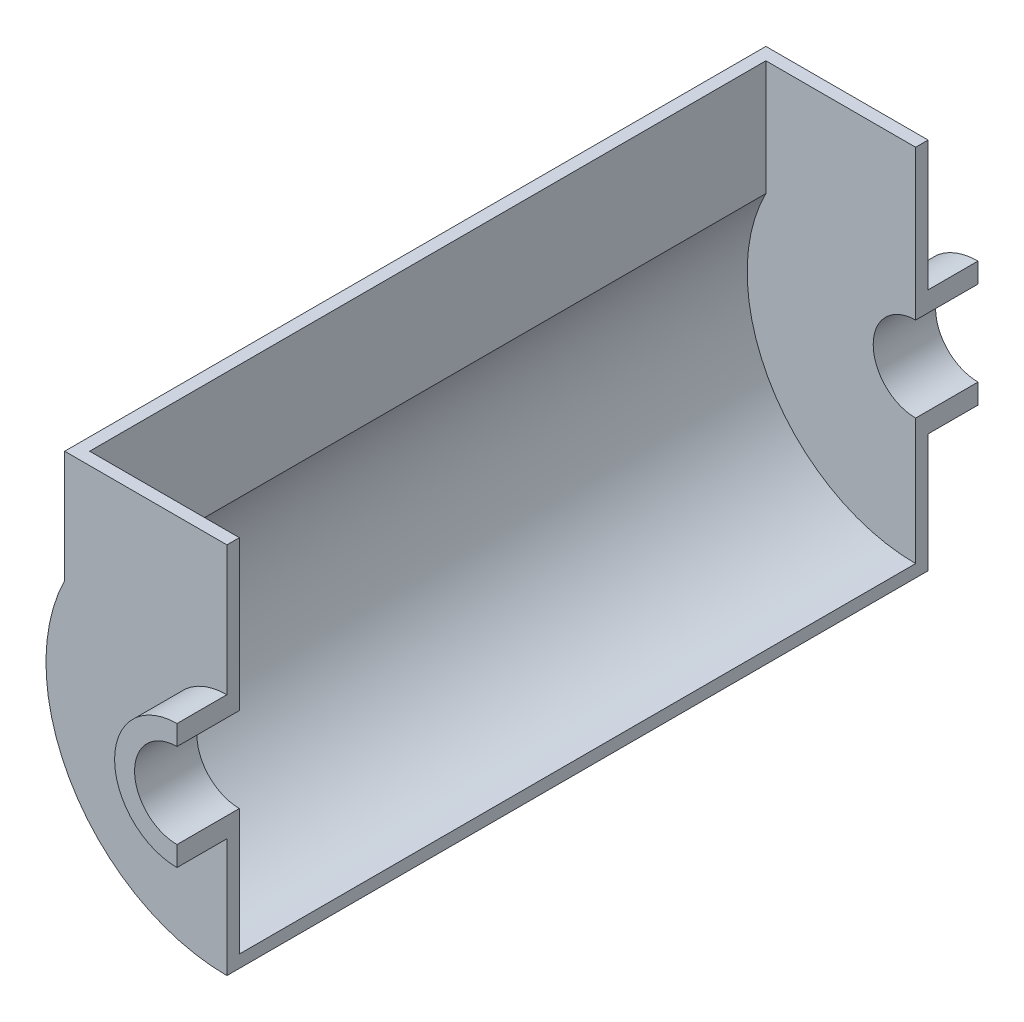
ISO-10303-21;
HEADER;
FILE_DESCRIPTION(('STEP AP214'),'2;1');
FILE_NAME('part.step','',(''),(''),'','','');
FILE_SCHEMA(('AUTOMOTIVE_DESIGN { 1 0 10303 214 1 1 1 1 }'));
ENDSEC;
DATA;
#1=APPLICATION_CONTEXT('core data for automotive mechanical design processes');
#2=APPLICATION_PROTOCOL_DEFINITION('international standard','automotive_design',2000,#1);
#3=PRODUCT_CONTEXT('',#1,'mechanical');
#4=PRODUCT('Part','Part','',(#3));
#5=PRODUCT_RELATED_PRODUCT_CATEGORY('part','',(#4));
#6=PRODUCT_DEFINITION_FORMATION('','',#4);
#7=PRODUCT_DEFINITION_CONTEXT('part definition',#1,'design');
#8=PRODUCT_DEFINITION('design','',#6,#7);
#9=PRODUCT_DEFINITION_SHAPE('','',#8);
#10=(LENGTH_UNIT() NAMED_UNIT(*) SI_UNIT(.MILLI.,.METRE.));
#11=(NAMED_UNIT(*) PLANE_ANGLE_UNIT() SI_UNIT($,.RADIAN.));
#12=(NAMED_UNIT(*) SI_UNIT($,.STERADIAN.) SOLID_ANGLE_UNIT());
#13=UNCERTAINTY_MEASURE_WITH_UNIT(LENGTH_MEASURE(1.E-05),#10,'distance_accuracy_value','');
#14=(GEOMETRIC_REPRESENTATION_CONTEXT(3) GLOBAL_UNCERTAINTY_ASSIGNED_CONTEXT((#13)) GLOBAL_UNIT_ASSIGNED_CONTEXT((#10,
#11,#12)) REPRESENTATION_CONTEXT('',''));
#15=CARTESIAN_POINT('',(0.,0.,0.));
#16=DIRECTION('',(0.,0.,1.));
#17=DIRECTION('',(1.,0.,0.));
#18=AXIS2_PLACEMENT_3D('',#15,#16,#17);
#19=CARTESIAN_POINT('',(0.,0.,-5.));
#20=DIRECTION('',(0.,0.,1.));
#21=DIRECTION('',(1.,0.,0.));
#22=AXIS2_PLACEMENT_3D('',#19,#20,#21);
#23=PLANE('',#22);
#24=CARTESIAN_POINT('',(0.,0.,-5.));
#25=DIRECTION('',(0.,0.,1.));
#26=DIRECTION('',(-1.,0.,0.));
#27=AXIS2_PLACEMENT_3D('',#24,#25,#26);
#28=CIRCLE('',#27,67.5);
#29=CARTESIAN_POINT('',(-60.,30.9232921921324,-5.));
#30=VERTEX_POINT('',#29);
#31=CARTESIAN_POINT('',(0.,-67.5,-5.));
#32=VERTEX_POINT('',#31);
#33=EDGE_CURVE('E197',#30,#32,#28,.T.);
#34=ORIENTED_EDGE('',*,*,#33,.F.);
#35=DIRECTION('',(0.,-1.,0.));
#36=VECTOR('',#35,1.);
#37=CARTESIAN_POINT('',(-60.,77.,-5.));
#38=LINE('',#37,#36);
#39=CARTESIAN_POINT('',(-60.,77.,-5.));
#40=VERTEX_POINT('',#39);
#41=EDGE_CURVE('E54',#40,#30,#38,.T.);
#42=ORIENTED_EDGE('',*,*,#41,.F.);
#43=DIRECTION('',(-1.,0.,0.));
#44=VECTOR('',#43,1.);
#45=CARTESIAN_POINT('',(0.,77.,-5.));
#46=LINE('',#45,#44);
#47=CARTESIAN_POINT('',(0.,77.,-5.));
#48=VERTEX_POINT('',#47);
#49=EDGE_CURVE('E213',#48,#40,#46,.T.);
#50=ORIENTED_EDGE('',*,*,#49,.F.);
#51=DIRECTION('',(0.,1.,0.));
#52=VECTOR('',#51,1.);
#53=CARTESIAN_POINT('',(0.,25.,-5.));
#54=LINE('',#53,#52);
#55=CARTESIAN_POINT('',(0.,17.,-5.));
#56=VERTEX_POINT('',#55);
#57=EDGE_CURVE('E255',#56,#48,#54,.T.);
#58=ORIENTED_EDGE('',*,*,#57,.F.);
#59=CARTESIAN_POINT('',(0.,0.,-5.));
#60=DIRECTION('',(0.,0.,-1.));
#61=DIRECTION('',(1.,0.,0.));
#62=AXIS2_PLACEMENT_3D('',#59,#60,#61);
#63=CIRCLE('',#62,17.);
#64=CARTESIAN_POINT('',(0.,-17.,-5.));
#65=VERTEX_POINT('',#64);
#66=EDGE_CURVE('E252',#65,#56,#63,.T.);
#67=ORIENTED_EDGE('',*,*,#66,.F.);
#68=DIRECTION('',(0.,1.,0.));
#69=VECTOR('',#68,1.);
#70=CARTESIAN_POINT('',(0.,-17.,-5.));
#71=LINE('',#70,#69);
#72=EDGE_CURVE('E60',#32,#65,#71,.T.);
#73=ORIENTED_EDGE('',*,*,#72,.F.);
#74=EDGE_LOOP('',(#34,#42,#50,#58,#67,#73));
#75=FACE_BOUND('',#74,.T.);
#76=ADVANCED_FACE('F37',(#75),#23,.F.);
#77=CARTESIAN_POINT('',(0.,0.,-5.));
#78=DIRECTION('',(0.,0.,1.));
#79=DIRECTION('',(1.,0.,0.));
#80=AXIS2_PLACEMENT_3D('',#77,#78,#79);
#81=CYLINDRICAL_SURFACE('',#80,17.);
#82=DIRECTION('',(0.,0.,1.));
#83=VECTOR('',#82,1.);
#84=CARTESIAN_POINT('',(0.,17.,-5.));
#85=LINE('',#84,#83);
#86=CARTESIAN_POINT('',(0.,17.,20.));
#87=VERTEX_POINT('',#86);
#88=EDGE_CURVE('E41',#56,#87,#85,.T.);
#89=ORIENTED_EDGE('',*,*,#88,.T.);
#90=CARTESIAN_POINT('',(0.,0.,20.));
#91=DIRECTION('',(0.,0.,-1.));
#92=DIRECTION('',(1.,0.,0.));
#93=AXIS2_PLACEMENT_3D('',#90,#91,#92);
#94=CIRCLE('',#93,17.);
#95=CARTESIAN_POINT('',(0.,-17.,20.));
#96=VERTEX_POINT('',#95);
#97=EDGE_CURVE('E235',#96,#87,#94,.T.);
#98=ORIENTED_EDGE('',*,*,#97,.F.);
#99=DIRECTION('',(0.,0.,1.));
#100=VECTOR('',#99,1.);
#101=CARTESIAN_POINT('',(0.,-17.,-5.));
#102=LINE('',#101,#100);
#103=EDGE_CURVE('E11',#65,#96,#102,.T.);
#104=ORIENTED_EDGE('',*,*,#103,.F.);
#105=ORIENTED_EDGE('',*,*,#66,.T.);
#106=EDGE_LOOP('',(#89,#98,#104,#105));
#107=FACE_BOUND('',#106,.T.);
#108=ADVANCED_FACE('F39',(#107),#81,.F.);
#109=CARTESIAN_POINT('',(0.,-17.,-5.));
#110=DIRECTION('',(1.,0.,0.));
#111=DIRECTION('',(0.,0.,-1.));
#112=AXIS2_PLACEMENT_3D('',#109,#110,#111);
#113=PLANE('',#112);
#114=ORIENTED_EDGE('',*,*,#103,.T.);
#115=DIRECTION('',(0.,1.,0.));
#116=VECTOR('',#115,1.);
#117=CARTESIAN_POINT('',(0.,-17.,20.));
#118=LINE('',#117,#116);
#119=CARTESIAN_POINT('',(0.,-25.,20.));
#120=VERTEX_POINT('',#119);
#121=EDGE_CURVE('E249',#120,#96,#118,.T.);
#122=ORIENTED_EDGE('',*,*,#121,.F.);
#123=DIRECTION('',(0.,0.,1.));
#124=VECTOR('',#123,1.);
#125=CARTESIAN_POINT('',(0.,-25.,-5.));
#126=LINE('',#125,#124);
#127=CARTESIAN_POINT('',(0.,-25.,0.));
#128=VERTEX_POINT('',#127);
#129=EDGE_CURVE('E46',#128,#120,#126,.T.);
#130=ORIENTED_EDGE('',*,*,#129,.F.);
#131=DIRECTION('',(0.,1.,0.));
#132=VECTOR('',#131,1.);
#133=CARTESIAN_POINT('',(0.,-25.,0.));
#134=LINE('',#133,#132);
#135=CARTESIAN_POINT('',(0.,-72.5,0.));
#136=VERTEX_POINT('',#135);
#137=EDGE_CURVE('E216',#136,#128,#134,.T.);
#138=ORIENTED_EDGE('',*,*,#137,.F.);
#139=DIRECTION('',(0.,0.,1.));
#140=VECTOR('',#139,1.);
#141=CARTESIAN_POINT('',(0.,-72.5,-5.));
#142=LINE('',#141,#140);
#143=CARTESIAN_POINT('',(0.,-72.5,-281.));
#144=VERTEX_POINT('',#143);
#145=EDGE_CURVE('E233',#144,#136,#142,.T.);
#146=ORIENTED_EDGE('',*,*,#145,.F.);
#147=DIRECTION('',(0.,1.,0.));
#148=VECTOR('',#147,1.);
#149=CARTESIAN_POINT('',(0.,-25.,-281.));
#150=LINE('',#149,#148);
#151=CARTESIAN_POINT('',(0.,-25.,-281.));
#152=VERTEX_POINT('',#151);
#153=EDGE_CURVE('E164',#144,#152,#150,.T.);
#154=ORIENTED_EDGE('',*,*,#153,.T.);
#155=DIRECTION('',(0.,0.,-1.));
#156=VECTOR('',#155,1.);
#157=CARTESIAN_POINT('',(0.,-25.,-276.));
#158=LINE('',#157,#156);
#159=CARTESIAN_POINT('',(0.,-25.,-301.));
#160=VERTEX_POINT('',#159);
#161=EDGE_CURVE('E190',#152,#160,#158,.T.);
#162=ORIENTED_EDGE('',*,*,#161,.T.);
#163=DIRECTION('',(0.,1.,0.));
#164=VECTOR('',#163,1.);
#165=CARTESIAN_POINT('',(0.,-17.,-301.));
#166=LINE('',#165,#164);
#167=CARTESIAN_POINT('',(0.,-17.,-301.));
#168=VERTEX_POINT('',#167);
#169=EDGE_CURVE('E183',#160,#168,#166,.T.);
#170=ORIENTED_EDGE('',*,*,#169,.T.);
#171=DIRECTION('',(0.,0.,-1.));
#172=VECTOR('',#171,1.);
#173=CARTESIAN_POINT('',(0.,-17.,-276.));
#174=LINE('',#173,#172);
#175=CARTESIAN_POINT('',(0.,-17.,-276.));
#176=VERTEX_POINT('',#175);
#177=EDGE_CURVE('E187',#176,#168,#174,.T.);
#178=ORIENTED_EDGE('',*,*,#177,.F.);
#179=DIRECTION('',(0.,1.,0.));
#180=VECTOR('',#179,1.);
#181=CARTESIAN_POINT('',(0.,-17.,-276.));
#182=LINE('',#181,#180);
#183=CARTESIAN_POINT('',(0.,-67.5,-276.));
#184=VERTEX_POINT('',#183);
#185=EDGE_CURVE('E179',#184,#176,#182,.T.);
#186=ORIENTED_EDGE('',*,*,#185,.F.);
#187=DIRECTION('',(0.,0.,1.));
#188=VECTOR('',#187,1.);
#189=CARTESIAN_POINT('',(0.,-67.5,-442.152038807834));
#190=LINE('',#189,#188);
#191=EDGE_CURVE('E200',#184,#32,#190,.T.);
#192=ORIENTED_EDGE('',*,*,#191,.T.);
#193=ORIENTED_EDGE('',*,*,#72,.T.);
#194=EDGE_LOOP('',(#114,#122,#130,#138,#146,#154,#162,#170,#178,#186,#192,#193));
#195=FACE_BOUND('',#194,.T.);
#196=ADVANCED_FACE('F273',(#195),#113,.T.);
#197=CARTESIAN_POINT('',(0.,0.,-5.));
#198=DIRECTION('',(0.,0.,1.));
#199=DIRECTION('',(1.,0.,0.));
#200=AXIS2_PLACEMENT_3D('',#197,#198,#199);
#201=CYLINDRICAL_SURFACE('',#200,25.);
#202=CARTESIAN_POINT('',(0.,0.,0.));
#203=DIRECTION('',(0.,0.,-1.));
#204=DIRECTION('',(1.,0.,0.));
#205=AXIS2_PLACEMENT_3D('',#202,#203,#204);
#206=CIRCLE('',#205,25.);
#207=CARTESIAN_POINT('',(0.,25.,0.));
#208=VERTEX_POINT('',#207);
#209=EDGE_CURVE('E206',#128,#208,#206,.T.);
#210=ORIENTED_EDGE('',*,*,#209,.F.);
#211=ORIENTED_EDGE('',*,*,#129,.T.);
#212=CARTESIAN_POINT('',(0.,0.,20.));
#213=DIRECTION('',(0.,0.,1.));
#214=DIRECTION('',(1.,0.,0.));
#215=AXIS2_PLACEMENT_3D('',#212,#213,#214);
#216=CIRCLE('',#215,25.);
#217=CARTESIAN_POINT('',(0.,25.,20.));
#218=VERTEX_POINT('',#217);
#219=EDGE_CURVE('E246',#218,#120,#216,.T.);
#220=ORIENTED_EDGE('',*,*,#219,.F.);
#221=DIRECTION('',(0.,0.,1.));
#222=VECTOR('',#221,1.);
#223=CARTESIAN_POINT('',(0.,25.,-5.));
#224=LINE('',#223,#222);
#225=EDGE_CURVE('E258',#208,#218,#224,.T.);
#226=ORIENTED_EDGE('',*,*,#225,.F.);
#227=EDGE_LOOP('',(#210,#211,#220,#226));
#228=FACE_BOUND('',#227,.T.);
#229=ADVANCED_FACE('F280',(#228),#201,.T.);
#230=CARTESIAN_POINT('',(0.,25.,-5.));
#231=DIRECTION('',(1.,0.,0.));
#232=DIRECTION('',(0.,0.,-1.));
#233=AXIS2_PLACEMENT_3D('',#230,#231,#232);
#234=PLANE('',#233);
#235=ORIENTED_EDGE('',*,*,#57,.T.);
#236=DIRECTION('',(0.,0.,1.));
#237=VECTOR('',#236,1.);
#238=CARTESIAN_POINT('',(0.,77.,-5.));
#239=LINE('',#238,#237);
#240=CARTESIAN_POINT('',(0.,77.,0.));
#241=VERTEX_POINT('',#240);
#242=EDGE_CURVE('E215',#48,#241,#239,.T.);
#243=ORIENTED_EDGE('',*,*,#242,.T.);
#244=DIRECTION('',(0.,1.,0.));
#245=VECTOR('',#244,1.);
#246=CARTESIAN_POINT('',(0.,25.,0.));
#247=LINE('',#246,#245);
#248=EDGE_CURVE('E219',#208,#241,#247,.T.);
#249=ORIENTED_EDGE('',*,*,#248,.F.);
#250=ORIENTED_EDGE('',*,*,#225,.T.);
#251=DIRECTION('',(0.,1.,0.));
#252=VECTOR('',#251,1.);
#253=CARTESIAN_POINT('',(0.,25.,20.));
#254=LINE('',#253,#252);
#255=EDGE_CURVE('E243',#87,#218,#254,.T.);
#256=ORIENTED_EDGE('',*,*,#255,.F.);
#257=ORIENTED_EDGE('',*,*,#88,.F.);
#258=EDGE_LOOP('',(#235,#243,#249,#250,#256,#257));
#259=FACE_BOUND('',#258,.T.);
#260=ADVANCED_FACE('F266',(#259),#234,.T.);
#261=CARTESIAN_POINT('',(0.,0.,20.));
#262=DIRECTION('',(0.,0.,1.));
#263=DIRECTION('',(1.,0.,0.));
#264=AXIS2_PLACEMENT_3D('',#261,#262,#263);
#265=PLANE('',#264);
#266=ORIENTED_EDGE('',*,*,#97,.T.);
#267=ORIENTED_EDGE('',*,*,#255,.T.);
#268=ORIENTED_EDGE('',*,*,#219,.T.);
#269=ORIENTED_EDGE('',*,*,#121,.T.);
#270=EDGE_LOOP('',(#266,#267,#268,#269));
#271=FACE_BOUND('',#270,.T.);
#272=ADVANCED_FACE('F269',(#271),#265,.T.);
#273=CARTESIAN_POINT('',(0.,0.,-5.));
#274=DIRECTION('',(0.,0.,1.));
#275=DIRECTION('',(1.,0.,0.));
#276=AXIS2_PLACEMENT_3D('',#273,#274,#275);
#277=CYLINDRICAL_SURFACE('',#276,72.5);
#278=CARTESIAN_POINT('',(0.,0.,0.));
#279=DIRECTION('',(0.,0.,1.));
#280=DIRECTION('',(1.,0.,0.));
#281=AXIS2_PLACEMENT_3D('',#278,#279,#280);
#282=CIRCLE('',#281,72.5);
#283=CARTESIAN_POINT('',(-65.,32.1130814466629,0.));
#284=VERTEX_POINT('',#283);
#285=EDGE_CURVE('E228',#284,#136,#282,.T.);
#286=ORIENTED_EDGE('',*,*,#285,.F.);
#287=DIRECTION('',(0.,0.,1.));
#288=VECTOR('',#287,1.);
#289=CARTESIAN_POINT('',(-65.,32.1130814466629,-5.));
#290=LINE('',#289,#288);
#291=CARTESIAN_POINT('',(-65.,32.1130814466629,-281.));
#292=VERTEX_POINT('',#291);
#293=EDGE_CURVE('E236',#292,#284,#290,.T.);
#294=ORIENTED_EDGE('',*,*,#293,.F.);
#295=CARTESIAN_POINT('',(0.,0.,-281.));
#296=DIRECTION('',(0.,0.,1.));
#297=DIRECTION('',(1.,0.,0.));
#298=AXIS2_PLACEMENT_3D('',#295,#296,#297);
#299=CIRCLE('',#298,72.5);
#300=EDGE_CURVE('E348',#292,#144,#299,.T.);
#301=ORIENTED_EDGE('',*,*,#300,.T.);
#302=ORIENTED_EDGE('',*,*,#145,.T.);
#303=EDGE_LOOP('',(#286,#294,#301,#302));
#304=FACE_BOUND('',#303,.T.);
#305=ADVANCED_FACE('F296',(#304),#277,.T.);
#306=CARTESIAN_POINT('',(-65.,77.,-5.));
#307=DIRECTION('',(-1.,0.,0.));
#308=DIRECTION('',(0.,-1.,0.));
#309=AXIS2_PLACEMENT_3D('',#306,#307,#308);
#310=PLANE('',#309);
#311=DIRECTION('',(0.,-1.,0.));
#312=VECTOR('',#311,1.);
#313=CARTESIAN_POINT('',(-65.,77.,0.));
#314=LINE('',#313,#312);
#315=CARTESIAN_POINT('',(-65.,77.,0.));
#316=VERTEX_POINT('',#315);
#317=EDGE_CURVE('E225',#316,#284,#314,.T.);
#318=ORIENTED_EDGE('',*,*,#317,.F.);
#319=DIRECTION('',(0.,0.,1.));
#320=VECTOR('',#319,1.);
#321=CARTESIAN_POINT('',(-65.,77.,-5.));
#322=LINE('',#321,#320);
#323=CARTESIAN_POINT('',(-65.,77.,-281.));
#324=VERTEX_POINT('',#323);
#325=EDGE_CURVE('E238',#324,#316,#322,.T.);
#326=ORIENTED_EDGE('',*,*,#325,.F.);
#327=DIRECTION('',(0.,-1.,0.));
#328=VECTOR('',#327,1.);
#329=CARTESIAN_POINT('',(-65.,77.,-281.));
#330=LINE('',#329,#328);
#331=EDGE_CURVE('E350',#324,#292,#330,.T.);
#332=ORIENTED_EDGE('',*,*,#331,.T.);
#333=ORIENTED_EDGE('',*,*,#293,.T.);
#334=EDGE_LOOP('',(#318,#326,#332,#333));
#335=FACE_BOUND('',#334,.T.);
#336=ADVANCED_FACE('F299',(#335),#310,.T.);
#337=CARTESIAN_POINT('',(0.,77.,-5.));
#338=DIRECTION('',(0.,1.,0.));
#339=DIRECTION('',(-1.,0.,0.));
#340=AXIS2_PLACEMENT_3D('',#337,#338,#339);
#341=PLANE('',#340);
#342=DIRECTION('',(-1.,0.,0.));
#343=VECTOR('',#342,1.);
#344=CARTESIAN_POINT('',(0.,77.,0.));
#345=LINE('',#344,#343);
#346=EDGE_CURVE('E222',#241,#316,#345,.T.);
#347=ORIENTED_EDGE('',*,*,#346,.F.);
#348=ORIENTED_EDGE('',*,*,#242,.F.);
#349=ORIENTED_EDGE('',*,*,#49,.T.);
#350=DIRECTION('',(0.,0.,1.));
#351=VECTOR('',#350,1.);
#352=CARTESIAN_POINT('',(-60.,77.,-442.152038807834));
#353=LINE('',#352,#351);
#354=CARTESIAN_POINT('',(-60.,77.,-276.));
#355=VERTEX_POINT('',#354);
#356=EDGE_CURVE('E160',#355,#40,#353,.T.);
#357=ORIENTED_EDGE('',*,*,#356,.F.);
#358=DIRECTION('',(-1.,0.,0.));
#359=VECTOR('',#358,1.);
#360=CARTESIAN_POINT('',(0.,77.,-276.));
#361=LINE('',#360,#359);
#362=CARTESIAN_POINT('',(0.,77.,-276.));
#363=VERTEX_POINT('',#362);
#364=EDGE_CURVE('E152',#363,#355,#361,.T.);
#365=ORIENTED_EDGE('',*,*,#364,.F.);
#366=DIRECTION('',(0.,0.,-1.));
#367=VECTOR('',#366,1.);
#368=CARTESIAN_POINT('',(0.,77.,-276.));
#369=LINE('',#368,#367);
#370=CARTESIAN_POINT('',(0.,77.,-281.));
#371=VERTEX_POINT('',#370);
#372=EDGE_CURVE('E157',#363,#371,#369,.T.);
#373=ORIENTED_EDGE('',*,*,#372,.T.);
#374=DIRECTION('',(-1.,0.,0.));
#375=VECTOR('',#374,1.);
#376=CARTESIAN_POINT('',(0.,77.,-281.));
#377=LINE('',#376,#375);
#378=EDGE_CURVE('E364',#371,#324,#377,.T.);
#379=ORIENTED_EDGE('',*,*,#378,.T.);
#380=ORIENTED_EDGE('',*,*,#325,.T.);
#381=EDGE_LOOP('',(#347,#348,#349,#357,#365,#373,#379,#380));
#382=FACE_BOUND('',#381,.T.);
#383=ADVANCED_FACE('F155',(#382),#341,.T.);
#384=CARTESIAN_POINT('',(0.,0.,0.));
#385=DIRECTION('',(0.,0.,1.));
#386=DIRECTION('',(1.,0.,0.));
#387=AXIS2_PLACEMENT_3D('',#384,#385,#386);
#388=PLANE('',#387);
#389=ORIENTED_EDGE('',*,*,#209,.T.);
#390=ORIENTED_EDGE('',*,*,#248,.T.);
#391=ORIENTED_EDGE('',*,*,#346,.T.);
#392=ORIENTED_EDGE('',*,*,#317,.T.);
#393=ORIENTED_EDGE('',*,*,#285,.T.);
#394=ORIENTED_EDGE('',*,*,#137,.T.);
#395=EDGE_LOOP('',(#389,#390,#391,#392,#393,#394));
#396=FACE_BOUND('',#395,.T.);
#397=ADVANCED_FACE('F278',(#396),#388,.T.);
#398=CARTESIAN_POINT('',(-60.,77.,-442.152038807834));
#399=DIRECTION('',(-1.,0.,0.));
#400=DIRECTION('',(0.,0.,1.));
#401=AXIS2_PLACEMENT_3D('',#398,#399,#400);
#402=PLANE('',#401);
#403=DIRECTION('',(0.,-1.,0.));
#404=VECTOR('',#403,1.);
#405=CARTESIAN_POINT('',(-60.,77.,-276.));
#406=LINE('',#405,#404);
#407=CARTESIAN_POINT('',(-60.,30.9232921921324,-276.));
#408=VERTEX_POINT('',#407);
#409=EDGE_CURVE('E207',#355,#408,#406,.T.);
#410=ORIENTED_EDGE('',*,*,#409,.F.);
#411=ORIENTED_EDGE('',*,*,#356,.T.);
#412=ORIENTED_EDGE('',*,*,#41,.T.);
#413=DIRECTION('',(0.,0.,1.));
#414=VECTOR('',#413,1.);
#415=CARTESIAN_POINT('',(-60.,30.9232921921324,-442.152038807834));
#416=LINE('',#415,#414);
#417=EDGE_CURVE('E201',#408,#30,#416,.T.);
#418=ORIENTED_EDGE('',*,*,#417,.F.);
#419=EDGE_LOOP('',(#410,#411,#412,#418));
#420=FACE_BOUND('',#419,.T.);
#421=ADVANCED_FACE('F308',(#420),#402,.F.);
#422=CARTESIAN_POINT('',(0.,0.,-442.152038807834));
#423=DIRECTION('',(0.,0.,1.));
#424=DIRECTION('',(1.,0.,0.));
#425=AXIS2_PLACEMENT_3D('',#422,#423,#424);
#426=CYLINDRICAL_SURFACE('',#425,67.5);
#427=CARTESIAN_POINT('',(0.,0.,-276.));
#428=DIRECTION('',(0.,0.,-1.));
#429=DIRECTION('',(-1.,0.,0.));
#430=AXIS2_PLACEMENT_3D('',#427,#428,#429);
#431=CIRCLE('',#430,67.5);
#432=EDGE_CURVE('E203',#408,#184,#431,.F.);
#433=ORIENTED_EDGE('',*,*,#432,.F.);
#434=ORIENTED_EDGE('',*,*,#417,.T.);
#435=ORIENTED_EDGE('',*,*,#33,.T.);
#436=ORIENTED_EDGE('',*,*,#191,.F.);
#437=EDGE_LOOP('',(#433,#434,#435,#436));
#438=FACE_BOUND('',#437,.T.);
#439=ADVANCED_FACE('F311',(#438),#426,.F.);
#440=CARTESIAN_POINT('',(0.,0.,-276.));
#441=DIRECTION('',(0.,0.,-1.));
#442=DIRECTION('',(1.,0.,0.));
#443=AXIS2_PLACEMENT_3D('',#440,#441,#442);
#444=PLANE('',#443);
#445=ORIENTED_EDGE('',*,*,#364,.T.);
#446=ORIENTED_EDGE('',*,*,#409,.T.);
#447=ORIENTED_EDGE('',*,*,#432,.T.);
#448=ORIENTED_EDGE('',*,*,#185,.T.);
#449=CARTESIAN_POINT('',(0.,0.,-276.));
#450=DIRECTION('',(0.,0.,-1.));
#451=DIRECTION('',(1.,0.,0.));
#452=AXIS2_PLACEMENT_3D('',#449,#450,#451);
#453=CIRCLE('',#452,17.);
#454=CARTESIAN_POINT('',(0.,17.,-276.));
#455=VERTEX_POINT('',#454);
#456=EDGE_CURVE('E177',#176,#455,#453,.T.);
#457=ORIENTED_EDGE('',*,*,#456,.T.);
#458=DIRECTION('',(0.,1.,0.));
#459=VECTOR('',#458,1.);
#460=CARTESIAN_POINT('',(0.,25.,-276.));
#461=LINE('',#460,#459);
#462=EDGE_CURVE('E169',#455,#363,#461,.T.);
#463=ORIENTED_EDGE('',*,*,#462,.T.);
#464=EDGE_LOOP('',(#445,#446,#447,#448,#457,#463));
#465=FACE_BOUND('',#464,.T.);
#466=ADVANCED_FACE('F175',(#465),#444,.F.);
#467=CARTESIAN_POINT('',(0.,0.,-276.));
#468=DIRECTION('',(0.,0.,-1.));
#469=DIRECTION('',(1.,0.,0.));
#470=AXIS2_PLACEMENT_3D('',#467,#468,#469);
#471=CYLINDRICAL_SURFACE('',#470,17.);
#472=DIRECTION('',(0.,0.,-1.));
#473=VECTOR('',#472,1.);
#474=CARTESIAN_POINT('',(0.,17.,-276.));
#475=LINE('',#474,#473);
#476=CARTESIAN_POINT('',(0.,17.,-301.));
#477=VERTEX_POINT('',#476);
#478=EDGE_CURVE('E181',#455,#477,#475,.T.);
#479=ORIENTED_EDGE('',*,*,#478,.F.);
#480=ORIENTED_EDGE('',*,*,#456,.F.);
#481=ORIENTED_EDGE('',*,*,#177,.T.);
#482=CARTESIAN_POINT('',(0.,0.,-301.));
#483=DIRECTION('',(0.,0.,-1.));
#484=DIRECTION('',(1.,0.,0.));
#485=AXIS2_PLACEMENT_3D('',#482,#483,#484);
#486=CIRCLE('',#485,17.);
#487=EDGE_CURVE('E173',#168,#477,#486,.T.);
#488=ORIENTED_EDGE('',*,*,#487,.T.);
#489=EDGE_LOOP('',(#479,#480,#481,#488));
#490=FACE_BOUND('',#489,.T.);
#491=ADVANCED_FACE('F316',(#490),#471,.F.);
#492=CARTESIAN_POINT('',(0.,0.,-276.));
#493=DIRECTION('',(0.,0.,-1.));
#494=DIRECTION('',(1.,0.,0.));
#495=AXIS2_PLACEMENT_3D('',#492,#493,#494);
#496=CYLINDRICAL_SURFACE('',#495,25.);
#497=CARTESIAN_POINT('',(0.,0.,-281.));
#498=DIRECTION('',(0.,0.,-1.));
#499=DIRECTION('',(1.,0.,0.));
#500=AXIS2_PLACEMENT_3D('',#497,#498,#499);
#501=CIRCLE('',#500,25.);
#502=CARTESIAN_POINT('',(0.,25.,-281.));
#503=VERTEX_POINT('',#502);
#504=EDGE_CURVE('E339',#152,#503,#501,.T.);
#505=ORIENTED_EDGE('',*,*,#504,.T.);
#506=DIRECTION('',(0.,0.,-1.));
#507=VECTOR('',#506,1.);
#508=CARTESIAN_POINT('',(0.,25.,-276.));
#509=LINE('',#508,#507);
#510=CARTESIAN_POINT('',(0.,25.,-301.));
#511=VERTEX_POINT('',#510);
#512=EDGE_CURVE('E193',#503,#511,#509,.T.);
#513=ORIENTED_EDGE('',*,*,#512,.T.);
#514=CARTESIAN_POINT('',(0.,0.,-301.));
#515=DIRECTION('',(0.,0.,1.));
#516=DIRECTION('',(1.,0.,0.));
#517=AXIS2_PLACEMENT_3D('',#514,#515,#516);
#518=CIRCLE('',#517,25.);
#519=EDGE_CURVE('E345',#511,#160,#518,.T.);
#520=ORIENTED_EDGE('',*,*,#519,.T.);
#521=ORIENTED_EDGE('',*,*,#161,.F.);
#522=EDGE_LOOP('',(#505,#513,#520,#521));
#523=FACE_BOUND('',#522,.T.);
#524=ADVANCED_FACE('F319',(#523),#496,.T.);
#525=CARTESIAN_POINT('',(0.,25.,-276.));
#526=DIRECTION('',(1.,0.,0.));
#527=DIRECTION('',(0.,0.,1.));
#528=AXIS2_PLACEMENT_3D('',#525,#526,#527);
#529=PLANE('',#528);
#530=ORIENTED_EDGE('',*,*,#462,.F.);
#531=ORIENTED_EDGE('',*,*,#478,.T.);
#532=DIRECTION('',(0.,1.,0.));
#533=VECTOR('',#532,1.);
#534=CARTESIAN_POINT('',(0.,25.,-301.));
#535=LINE('',#534,#533);
#536=EDGE_CURVE('E356',#477,#511,#535,.T.);
#537=ORIENTED_EDGE('',*,*,#536,.T.);
#538=ORIENTED_EDGE('',*,*,#512,.F.);
#539=DIRECTION('',(0.,1.,0.));
#540=VECTOR('',#539,1.);
#541=CARTESIAN_POINT('',(0.,25.,-281.));
#542=LINE('',#541,#540);
#543=EDGE_CURVE('E172',#503,#371,#542,.T.);
#544=ORIENTED_EDGE('',*,*,#543,.T.);
#545=ORIENTED_EDGE('',*,*,#372,.F.);
#546=EDGE_LOOP('',(#530,#531,#537,#538,#544,#545));
#547=FACE_BOUND('',#546,.T.);
#548=ADVANCED_FACE('F167',(#547),#529,.T.);
#549=CARTESIAN_POINT('',(0.,0.,-301.));
#550=DIRECTION('',(0.,0.,-1.));
#551=DIRECTION('',(1.,0.,0.));
#552=AXIS2_PLACEMENT_3D('',#549,#550,#551);
#553=PLANE('',#552);
#554=ORIENTED_EDGE('',*,*,#487,.F.);
#555=ORIENTED_EDGE('',*,*,#169,.F.);
#556=ORIENTED_EDGE('',*,*,#519,.F.);
#557=ORIENTED_EDGE('',*,*,#536,.F.);
#558=EDGE_LOOP('',(#554,#555,#556,#557));
#559=FACE_BOUND('',#558,.T.);
#560=ADVANCED_FACE('F323',(#559),#553,.T.);
#561=CARTESIAN_POINT('',(0.,0.,-281.));
#562=DIRECTION('',(0.,0.,-1.));
#563=DIRECTION('',(1.,0.,0.));
#564=AXIS2_PLACEMENT_3D('',#561,#562,#563);
#565=PLANE('',#564);
#566=ORIENTED_EDGE('',*,*,#504,.F.);
#567=ORIENTED_EDGE('',*,*,#153,.F.);
#568=ORIENTED_EDGE('',*,*,#300,.F.);
#569=ORIENTED_EDGE('',*,*,#331,.F.);
#570=ORIENTED_EDGE('',*,*,#378,.F.);
#571=ORIENTED_EDGE('',*,*,#543,.F.);
#572=EDGE_LOOP('',(#566,#567,#568,#569,#570,#571));
#573=FACE_BOUND('',#572,.T.);
#574=ADVANCED_FACE('F331',(#573),#565,.T.);
#575=CLOSED_SHELL('',(#76,#108,#196,#229,#260,#272,#305,#336,#383,#397,#421,#439,#466,#491,#524,
#548,#560,#574));
#576=MANIFOLD_SOLID_BREP('B2',#575);
#577=ADVANCED_BREP_SHAPE_REPRESENTATION('',(#18,#576),#14);
#578=SHAPE_DEFINITION_REPRESENTATION(#9,#577);
ENDSEC;
END-ISO-10303-21;
